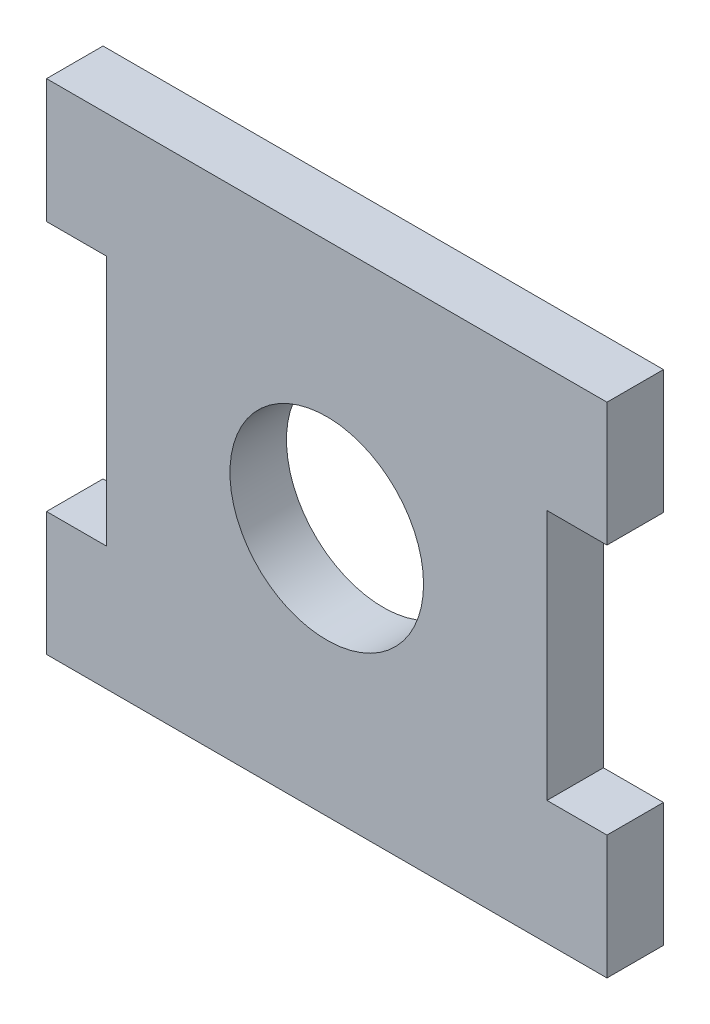
ISO-10303-21;
HEADER;
FILE_DESCRIPTION(('STEP AP214'),'2;1');
FILE_NAME('part.step','',(''),(''),'','','');
FILE_SCHEMA(('AUTOMOTIVE_DESIGN { 1 0 10303 214 1 1 1 1 }'));
ENDSEC;
DATA;
#1=APPLICATION_CONTEXT('core data for automotive mechanical design processes');
#2=APPLICATION_PROTOCOL_DEFINITION('international standard','automotive_design',2000,#1);
#3=PRODUCT_CONTEXT('',#1,'mechanical');
#4=PRODUCT('Part','Part','',(#3));
#5=PRODUCT_RELATED_PRODUCT_CATEGORY('part','',(#4));
#6=PRODUCT_DEFINITION_FORMATION('','',#4);
#7=PRODUCT_DEFINITION_CONTEXT('part definition',#1,'design');
#8=PRODUCT_DEFINITION('design','',#6,#7);
#9=PRODUCT_DEFINITION_SHAPE('','',#8);
#10=(LENGTH_UNIT() NAMED_UNIT(*) SI_UNIT(.MILLI.,.METRE.));
#11=(NAMED_UNIT(*) PLANE_ANGLE_UNIT() SI_UNIT($,.RADIAN.));
#12=(NAMED_UNIT(*) SI_UNIT($,.STERADIAN.) SOLID_ANGLE_UNIT());
#13=UNCERTAINTY_MEASURE_WITH_UNIT(LENGTH_MEASURE(1.E-05),#10,'distance_accuracy_value','');
#14=(GEOMETRIC_REPRESENTATION_CONTEXT(3) GLOBAL_UNCERTAINTY_ASSIGNED_CONTEXT((#13)) GLOBAL_UNIT_ASSIGNED_CONTEXT((#10,
#11,#12)) REPRESENTATION_CONTEXT('',''));
#15=CARTESIAN_POINT('',(0.,0.,0.));
#16=DIRECTION('',(0.,0.,1.));
#17=DIRECTION('',(1.,0.,0.));
#18=AXIS2_PLACEMENT_3D('',#15,#16,#17);
#19=CARTESIAN_POINT('',(0.,0.,5.715));
#20=DIRECTION('',(0.,0.,1.));
#21=DIRECTION('',(1.,0.,0.));
#22=AXIS2_PLACEMENT_3D('',#19,#20,#21);
#23=PLANE('',#22);
#24=DIRECTION('',(0.,-1.,0.));
#25=VECTOR('',#24,1.);
#26=CARTESIAN_POINT('',(0.,12.5222,5.715));
#27=LINE('',#26,#25);
#28=CARTESIAN_POINT('',(0.,12.5222,5.715));
#29=VERTEX_POINT('',#28);
#30=CARTESIAN_POINT('',(0.,0.,5.715));
#31=VERTEX_POINT('',#30);
#32=EDGE_CURVE('E181',#29,#31,#27,.T.);
#33=ORIENTED_EDGE('',*,*,#32,.T.);
#34=DIRECTION('',(1.,0.,0.));
#35=VECTOR('',#34,1.);
#36=CARTESIAN_POINT('',(0.,0.,5.715));
#37=LINE('',#36,#35);
#38=CARTESIAN_POINT('',(56.6928,0.,5.715));
#39=VERTEX_POINT('',#38);
#40=EDGE_CURVE('E109',#31,#39,#37,.T.);
#41=ORIENTED_EDGE('',*,*,#40,.T.);
#42=DIRECTION('',(0.,1.,0.));
#43=VECTOR('',#42,1.);
#44=CARTESIAN_POINT('',(56.6928,0.,5.715));
#45=LINE('',#44,#43);
#46=CARTESIAN_POINT('',(56.6928,12.5222,5.715));
#47=VERTEX_POINT('',#46);
#48=EDGE_CURVE('E208',#39,#47,#45,.T.);
#49=ORIENTED_EDGE('',*,*,#48,.T.);
#50=DIRECTION('',(-1.,0.,0.));
#51=VECTOR('',#50,1.);
#52=CARTESIAN_POINT('',(56.6928,12.5222,5.715));
#53=LINE('',#52,#51);
#54=CARTESIAN_POINT('',(50.6222,12.5222,5.715));
#55=VERTEX_POINT('',#54);
#56=EDGE_CURVE('E227',#47,#55,#53,.T.);
#57=ORIENTED_EDGE('',*,*,#56,.T.);
#58=DIRECTION('',(0.,1.,0.));
#59=VECTOR('',#58,1.);
#60=CARTESIAN_POINT('',(50.6222,12.5222,5.715));
#61=LINE('',#60,#59);
#62=CARTESIAN_POINT('',(50.6222,37.9222,5.715));
#63=VERTEX_POINT('',#62);
#64=EDGE_CURVE('E224',#55,#63,#61,.T.);
#65=ORIENTED_EDGE('',*,*,#64,.T.);
#66=DIRECTION('',(1.,0.,0.));
#67=VECTOR('',#66,1.);
#68=CARTESIAN_POINT('',(50.6222,37.9222,5.715));
#69=LINE('',#68,#67);
#70=CARTESIAN_POINT('',(56.6928,37.9222,5.715));
#71=VERTEX_POINT('',#70);
#72=EDGE_CURVE('E226',#63,#71,#69,.T.);
#73=ORIENTED_EDGE('',*,*,#72,.T.);
#74=DIRECTION('',(0.,1.,0.));
#75=VECTOR('',#74,1.);
#76=CARTESIAN_POINT('',(56.6928,37.9222,5.715));
#77=LINE('',#76,#75);
#78=CARTESIAN_POINT('',(56.6928,50.4444,5.715));
#79=VERTEX_POINT('',#78);
#80=EDGE_CURVE('E229',#71,#79,#77,.T.);
#81=ORIENTED_EDGE('',*,*,#80,.T.);
#82=DIRECTION('',(-1.,0.,0.));
#83=VECTOR('',#82,1.);
#84=CARTESIAN_POINT('',(56.6928,50.4444,5.715));
#85=LINE('',#84,#83);
#86=CARTESIAN_POINT('',(0.,50.4444,5.715));
#87=VERTEX_POINT('',#86);
#88=EDGE_CURVE('E235',#79,#87,#85,.T.);
#89=ORIENTED_EDGE('',*,*,#88,.T.);
#90=DIRECTION('',(0.,-1.,0.));
#91=VECTOR('',#90,1.);
#92=CARTESIAN_POINT('',(0.,50.4444,5.715));
#93=LINE('',#92,#91);
#94=CARTESIAN_POINT('',(0.,37.9222,5.715));
#95=VERTEX_POINT('',#94);
#96=EDGE_CURVE('E140',#87,#95,#93,.T.);
#97=ORIENTED_EDGE('',*,*,#96,.T.);
#98=DIRECTION('',(1.,0.,0.));
#99=VECTOR('',#98,1.);
#100=CARTESIAN_POINT('',(0.,37.9222,5.715));
#101=LINE('',#100,#99);
#102=CARTESIAN_POINT('',(6.0706,37.9222,5.715));
#103=VERTEX_POINT('',#102);
#104=EDGE_CURVE('E134',#95,#103,#101,.T.);
#105=ORIENTED_EDGE('',*,*,#104,.T.);
#106=DIRECTION('',(0.,-1.,0.));
#107=VECTOR('',#106,1.);
#108=CARTESIAN_POINT('',(6.0706,37.9222,5.715));
#109=LINE('',#108,#107);
#110=CARTESIAN_POINT('',(6.0706,12.5222,5.715));
#111=VERTEX_POINT('',#110);
#112=EDGE_CURVE('E138',#103,#111,#109,.T.);
#113=ORIENTED_EDGE('',*,*,#112,.T.);
#114=DIRECTION('',(-1.,0.,0.));
#115=VECTOR('',#114,1.);
#116=CARTESIAN_POINT('',(6.0706,12.5222,5.715));
#117=LINE('',#116,#115);
#118=EDGE_CURVE('E54',#111,#29,#117,.T.);
#119=ORIENTED_EDGE('',*,*,#118,.T.);
#120=EDGE_LOOP('',(#33,#41,#49,#57,#65,#73,#81,#89,#97,#105,#113,#119));
#121=FACE_BOUND('',#120,.T.);
#122=CARTESIAN_POINT('',(28.3464,25.2222,5.715));
#123=DIRECTION('',(0.,0.,1.));
#124=DIRECTION('',(1.,0.,0.));
#125=AXIS2_PLACEMENT_3D('',#122,#123,#124);
#126=CIRCLE('',#125,9.79170000000001);
#127=CARTESIAN_POINT('',(38.1381,25.2222,5.715));
#128=VERTEX_POINT('',#127);
#129=EDGE_CURVE('E162',#128,#128,#126,.T.);
#130=ORIENTED_EDGE('',*,*,#129,.F.);
#131=EDGE_LOOP('',(#130));
#132=FACE_BOUND('',#131,.T.);
#133=ADVANCED_FACE('F37',(#121,#132),#23,.T.);
#134=CARTESIAN_POINT('',(0.,0.,0.));
#135=DIRECTION('',(0.,0.,1.));
#136=DIRECTION('',(1.,0.,0.));
#137=AXIS2_PLACEMENT_3D('',#134,#135,#136);
#138=PLANE('',#137);
#139=DIRECTION('',(0.,-1.,0.));
#140=VECTOR('',#139,1.);
#141=CARTESIAN_POINT('',(0.,12.5222,0.));
#142=LINE('',#141,#140);
#143=CARTESIAN_POINT('',(0.,12.5222,0.));
#144=VERTEX_POINT('',#143);
#145=CARTESIAN_POINT('',(0.,0.,0.));
#146=VERTEX_POINT('',#145);
#147=EDGE_CURVE('E158',#144,#146,#142,.T.);
#148=ORIENTED_EDGE('',*,*,#147,.F.);
#149=DIRECTION('',(-1.,0.,0.));
#150=VECTOR('',#149,1.);
#151=CARTESIAN_POINT('',(6.0706,12.5222,0.));
#152=LINE('',#151,#150);
#153=CARTESIAN_POINT('',(6.0706,12.5222,0.));
#154=VERTEX_POINT('',#153);
#155=EDGE_CURVE('E101',#154,#144,#152,.T.);
#156=ORIENTED_EDGE('',*,*,#155,.F.);
#157=DIRECTION('',(0.,-1.,0.));
#158=VECTOR('',#157,1.);
#159=CARTESIAN_POINT('',(6.0706,37.9222,0.));
#160=LINE('',#159,#158);
#161=CARTESIAN_POINT('',(6.0706,37.9222,0.));
#162=VERTEX_POINT('',#161);
#163=EDGE_CURVE('E95',#162,#154,#160,.T.);
#164=ORIENTED_EDGE('',*,*,#163,.F.);
#165=DIRECTION('',(1.,0.,0.));
#166=VECTOR('',#165,1.);
#167=CARTESIAN_POINT('',(0.,37.9222,0.));
#168=LINE('',#167,#166);
#169=CARTESIAN_POINT('',(0.,37.9222,0.));
#170=VERTEX_POINT('',#169);
#171=EDGE_CURVE('E148',#170,#162,#168,.T.);
#172=ORIENTED_EDGE('',*,*,#171,.F.);
#173=DIRECTION('',(0.,-1.,0.));
#174=VECTOR('',#173,1.);
#175=CARTESIAN_POINT('',(0.,50.4444,0.));
#176=LINE('',#175,#174);
#177=CARTESIAN_POINT('',(0.,50.4444,0.));
#178=VERTEX_POINT('',#177);
#179=EDGE_CURVE('E176',#178,#170,#176,.T.);
#180=ORIENTED_EDGE('',*,*,#179,.F.);
#181=DIRECTION('',(-1.,0.,0.));
#182=VECTOR('',#181,1.);
#183=CARTESIAN_POINT('',(56.6928,50.4444,0.));
#184=LINE('',#183,#182);
#185=CARTESIAN_POINT('',(56.6928,50.4444,0.));
#186=VERTEX_POINT('',#185);
#187=EDGE_CURVE('E174',#186,#178,#184,.T.);
#188=ORIENTED_EDGE('',*,*,#187,.F.);
#189=DIRECTION('',(0.,1.,0.));
#190=VECTOR('',#189,1.);
#191=CARTESIAN_POINT('',(56.6928,37.9222,0.));
#192=LINE('',#191,#190);
#193=CARTESIAN_POINT('',(56.6928,37.9222,0.));
#194=VERTEX_POINT('',#193);
#195=EDGE_CURVE('E172',#194,#186,#192,.T.);
#196=ORIENTED_EDGE('',*,*,#195,.F.);
#197=DIRECTION('',(1.,0.,0.));
#198=VECTOR('',#197,1.);
#199=CARTESIAN_POINT('',(50.6222,37.9222,0.));
#200=LINE('',#199,#198);
#201=CARTESIAN_POINT('',(50.6222,37.9222,0.));
#202=VERTEX_POINT('',#201);
#203=EDGE_CURVE('E170',#202,#194,#200,.T.);
#204=ORIENTED_EDGE('',*,*,#203,.F.);
#205=DIRECTION('',(0.,1.,0.));
#206=VECTOR('',#205,1.);
#207=CARTESIAN_POINT('',(50.6222,12.5222,0.));
#208=LINE('',#207,#206);
#209=CARTESIAN_POINT('',(50.6222,12.5222,0.));
#210=VERTEX_POINT('',#209);
#211=EDGE_CURVE('E168',#210,#202,#208,.T.);
#212=ORIENTED_EDGE('',*,*,#211,.F.);
#213=DIRECTION('',(-1.,0.,0.));
#214=VECTOR('',#213,1.);
#215=CARTESIAN_POINT('',(56.6928,12.5222,0.));
#216=LINE('',#215,#214);
#217=CARTESIAN_POINT('',(56.6928,12.5222,0.));
#218=VERTEX_POINT('',#217);
#219=EDGE_CURVE('E166',#218,#210,#216,.T.);
#220=ORIENTED_EDGE('',*,*,#219,.F.);
#221=DIRECTION('',(0.,1.,0.));
#222=VECTOR('',#221,1.);
#223=CARTESIAN_POINT('',(56.6928,0.,0.));
#224=LINE('',#223,#222);
#225=CARTESIAN_POINT('',(56.6928,0.,0.));
#226=VERTEX_POINT('',#225);
#227=EDGE_CURVE('E164',#226,#218,#224,.T.);
#228=ORIENTED_EDGE('',*,*,#227,.F.);
#229=DIRECTION('',(1.,0.,0.));
#230=VECTOR('',#229,1.);
#231=CARTESIAN_POINT('',(0.,0.,0.));
#232=LINE('',#231,#230);
#233=EDGE_CURVE('E161',#146,#226,#232,.T.);
#234=ORIENTED_EDGE('',*,*,#233,.F.);
#235=EDGE_LOOP('',(#148,#156,#164,#172,#180,#188,#196,#204,#212,#220,#228,#234));
#236=FACE_BOUND('',#235,.T.);
#237=CARTESIAN_POINT('',(28.3464,25.2222,0.));
#238=DIRECTION('',(0.,0.,1.));
#239=DIRECTION('',(1.,0.,0.));
#240=AXIS2_PLACEMENT_3D('',#237,#238,#239);
#241=CIRCLE('',#240,9.79170000000001);
#242=CARTESIAN_POINT('',(38.1381,25.2222,0.));
#243=VERTEX_POINT('',#242);
#244=EDGE_CURVE('E382',#243,#243,#241,.T.);
#245=ORIENTED_EDGE('',*,*,#244,.T.);
#246=EDGE_LOOP('',(#245));
#247=FACE_BOUND('',#246,.T.);
#248=ADVANCED_FACE('F212',(#236,#247),#138,.F.);
#249=CARTESIAN_POINT('',(0.,12.5222,5.715));
#250=DIRECTION('',(1.,0.,0.));
#251=DIRECTION('',(0.,0.,-1.));
#252=AXIS2_PLACEMENT_3D('',#249,#250,#251);
#253=PLANE('',#252);
#254=ORIENTED_EDGE('',*,*,#147,.T.);
#255=DIRECTION('',(0.,0.,-1.));
#256=VECTOR('',#255,1.);
#257=CARTESIAN_POINT('',(0.,0.,5.715));
#258=LINE('',#257,#256);
#259=EDGE_CURVE('E11',#31,#146,#258,.T.);
#260=ORIENTED_EDGE('',*,*,#259,.F.);
#261=ORIENTED_EDGE('',*,*,#32,.F.);
#262=DIRECTION('',(0.,0.,-1.));
#263=VECTOR('',#262,1.);
#264=CARTESIAN_POINT('',(0.,12.5222,5.715));
#265=LINE('',#264,#263);
#266=EDGE_CURVE('E154',#29,#144,#265,.T.);
#267=ORIENTED_EDGE('',*,*,#266,.T.);
#268=EDGE_LOOP('',(#254,#260,#261,#267));
#269=FACE_BOUND('',#268,.T.);
#270=ADVANCED_FACE('F39',(#269),#253,.F.);
#271=CARTESIAN_POINT('',(0.,0.,5.715));
#272=DIRECTION('',(0.,1.,0.));
#273=DIRECTION('',(-1.,0.,0.));
#274=AXIS2_PLACEMENT_3D('',#271,#272,#273);
#275=PLANE('',#274);
#276=ORIENTED_EDGE('',*,*,#233,.T.);
#277=DIRECTION('',(0.,0.,-1.));
#278=VECTOR('',#277,1.);
#279=CARTESIAN_POINT('',(56.6928,0.,5.715));
#280=LINE('',#279,#278);
#281=EDGE_CURVE('E46',#39,#226,#280,.T.);
#282=ORIENTED_EDGE('',*,*,#281,.F.);
#283=ORIENTED_EDGE('',*,*,#40,.F.);
#284=ORIENTED_EDGE('',*,*,#259,.T.);
#285=EDGE_LOOP('',(#276,#282,#283,#284));
#286=FACE_BOUND('',#285,.T.);
#287=ADVANCED_FACE('F269',(#286),#275,.F.);
#288=CARTESIAN_POINT('',(56.6928,0.,5.715));
#289=DIRECTION('',(-1.,0.,0.));
#290=DIRECTION('',(0.,0.,1.));
#291=AXIS2_PLACEMENT_3D('',#288,#289,#290);
#292=PLANE('',#291);
#293=ORIENTED_EDGE('',*,*,#227,.T.);
#294=DIRECTION('',(0.,0.,-1.));
#295=VECTOR('',#294,1.);
#296=CARTESIAN_POINT('',(56.6928,12.5222,5.715));
#297=LINE('',#296,#295);
#298=EDGE_CURVE('E200',#47,#218,#297,.T.);
#299=ORIENTED_EDGE('',*,*,#298,.F.);
#300=ORIENTED_EDGE('',*,*,#48,.F.);
#301=ORIENTED_EDGE('',*,*,#281,.T.);
#302=EDGE_LOOP('',(#293,#299,#300,#301));
#303=FACE_BOUND('',#302,.T.);
#304=ADVANCED_FACE('F206',(#303),#292,.F.);
#305=CARTESIAN_POINT('',(56.6928,12.5222,5.715));
#306=DIRECTION('',(0.,-1.,0.));
#307=DIRECTION('',(1.,0.,0.));
#308=AXIS2_PLACEMENT_3D('',#305,#306,#307);
#309=PLANE('',#308);
#310=ORIENTED_EDGE('',*,*,#219,.T.);
#311=DIRECTION('',(0.,0.,-1.));
#312=VECTOR('',#311,1.);
#313=CARTESIAN_POINT('',(50.6222,12.5222,5.715));
#314=LINE('',#313,#312);
#315=EDGE_CURVE('E197',#55,#210,#314,.T.);
#316=ORIENTED_EDGE('',*,*,#315,.F.);
#317=ORIENTED_EDGE('',*,*,#56,.F.);
#318=ORIENTED_EDGE('',*,*,#298,.T.);
#319=EDGE_LOOP('',(#310,#316,#317,#318));
#320=FACE_BOUND('',#319,.T.);
#321=ADVANCED_FACE('F218',(#320),#309,.F.);
#322=CARTESIAN_POINT('',(50.6222,12.5222,5.715));
#323=DIRECTION('',(-1.,0.,0.));
#324=DIRECTION('',(0.,0.,1.));
#325=AXIS2_PLACEMENT_3D('',#322,#323,#324);
#326=PLANE('',#325);
#327=ORIENTED_EDGE('',*,*,#211,.T.);
#328=DIRECTION('',(0.,0.,-1.));
#329=VECTOR('',#328,1.);
#330=CARTESIAN_POINT('',(50.6222,37.9222,5.715));
#331=LINE('',#330,#329);
#332=EDGE_CURVE('E194',#63,#202,#331,.T.);
#333=ORIENTED_EDGE('',*,*,#332,.F.);
#334=ORIENTED_EDGE('',*,*,#64,.F.);
#335=ORIENTED_EDGE('',*,*,#315,.T.);
#336=EDGE_LOOP('',(#327,#333,#334,#335));
#337=FACE_BOUND('',#336,.T.);
#338=ADVANCED_FACE('F222',(#337),#326,.F.);
#339=CARTESIAN_POINT('',(50.6222,37.9222,5.715));
#340=DIRECTION('',(0.,1.,0.));
#341=DIRECTION('',(0.,0.,1.));
#342=AXIS2_PLACEMENT_3D('',#339,#340,#341);
#343=PLANE('',#342);
#344=ORIENTED_EDGE('',*,*,#203,.T.);
#345=DIRECTION('',(0.,0.,-1.));
#346=VECTOR('',#345,1.);
#347=CARTESIAN_POINT('',(56.6928,37.9222,5.715));
#348=LINE('',#347,#346);
#349=EDGE_CURVE('E191',#71,#194,#348,.T.);
#350=ORIENTED_EDGE('',*,*,#349,.F.);
#351=ORIENTED_EDGE('',*,*,#72,.F.);
#352=ORIENTED_EDGE('',*,*,#332,.T.);
#353=EDGE_LOOP('',(#344,#350,#351,#352));
#354=FACE_BOUND('',#353,.T.);
#355=ADVANCED_FACE('F282',(#354),#343,.F.);
#356=CARTESIAN_POINT('',(56.6928,37.9222,5.715));
#357=DIRECTION('',(-1.,0.,0.));
#358=DIRECTION('',(0.,0.,1.));
#359=AXIS2_PLACEMENT_3D('',#356,#357,#358);
#360=PLANE('',#359);
#361=ORIENTED_EDGE('',*,*,#195,.T.);
#362=DIRECTION('',(0.,0.,-1.));
#363=VECTOR('',#362,1.);
#364=CARTESIAN_POINT('',(56.6928,50.4444,5.715));
#365=LINE('',#364,#363);
#366=EDGE_CURVE('E188',#79,#186,#365,.T.);
#367=ORIENTED_EDGE('',*,*,#366,.F.);
#368=ORIENTED_EDGE('',*,*,#80,.F.);
#369=ORIENTED_EDGE('',*,*,#349,.T.);
#370=EDGE_LOOP('',(#361,#367,#368,#369));
#371=FACE_BOUND('',#370,.T.);
#372=ADVANCED_FACE('F285',(#371),#360,.F.);
#373=CARTESIAN_POINT('',(56.6928,50.4444,5.715));
#374=DIRECTION('',(0.,-1.,0.));
#375=DIRECTION('',(1.,0.,0.));
#376=AXIS2_PLACEMENT_3D('',#373,#374,#375);
#377=PLANE('',#376);
#378=ORIENTED_EDGE('',*,*,#187,.T.);
#379=DIRECTION('',(0.,0.,-1.));
#380=VECTOR('',#379,1.);
#381=CARTESIAN_POINT('',(0.,50.4444,5.715));
#382=LINE('',#381,#380);
#383=EDGE_CURVE('E185',#87,#178,#382,.T.);
#384=ORIENTED_EDGE('',*,*,#383,.F.);
#385=ORIENTED_EDGE('',*,*,#88,.F.);
#386=ORIENTED_EDGE('',*,*,#366,.T.);
#387=EDGE_LOOP('',(#378,#384,#385,#386));
#388=FACE_BOUND('',#387,.T.);
#389=ADVANCED_FACE('F241',(#388),#377,.F.);
#390=CARTESIAN_POINT('',(0.,50.4444,5.715));
#391=DIRECTION('',(1.,0.,0.));
#392=DIRECTION('',(0.,1.,0.));
#393=AXIS2_PLACEMENT_3D('',#390,#391,#392);
#394=PLANE('',#393);
#395=ORIENTED_EDGE('',*,*,#179,.T.);
#396=DIRECTION('',(0.,0.,-1.));
#397=VECTOR('',#396,1.);
#398=CARTESIAN_POINT('',(0.,37.9222,5.715));
#399=LINE('',#398,#397);
#400=EDGE_CURVE('E149',#95,#170,#399,.T.);
#401=ORIENTED_EDGE('',*,*,#400,.F.);
#402=ORIENTED_EDGE('',*,*,#96,.F.);
#403=ORIENTED_EDGE('',*,*,#383,.T.);
#404=EDGE_LOOP('',(#395,#401,#402,#403));
#405=FACE_BOUND('',#404,.T.);
#406=ADVANCED_FACE('F245',(#405),#394,.F.);
#407=CARTESIAN_POINT('',(0.,37.9222,5.715));
#408=DIRECTION('',(0.,1.,0.));
#409=DIRECTION('',(0.,0.,1.));
#410=AXIS2_PLACEMENT_3D('',#407,#408,#409);
#411=PLANE('',#410);
#412=ORIENTED_EDGE('',*,*,#171,.T.);
#413=DIRECTION('',(0.,0.,-1.));
#414=VECTOR('',#413,1.);
#415=CARTESIAN_POINT('',(6.0706,37.9222,5.715));
#416=LINE('',#415,#414);
#417=EDGE_CURVE('E145',#103,#162,#416,.T.);
#418=ORIENTED_EDGE('',*,*,#417,.F.);
#419=ORIENTED_EDGE('',*,*,#104,.F.);
#420=ORIENTED_EDGE('',*,*,#400,.T.);
#421=EDGE_LOOP('',(#412,#418,#419,#420));
#422=FACE_BOUND('',#421,.T.);
#423=ADVANCED_FACE('F146',(#422),#411,.F.);
#424=CARTESIAN_POINT('',(6.0706,37.9222,5.715));
#425=DIRECTION('',(1.,0.,0.));
#426=DIRECTION('',(0.,0.,-1.));
#427=AXIS2_PLACEMENT_3D('',#424,#425,#426);
#428=PLANE('',#427);
#429=ORIENTED_EDGE('',*,*,#163,.T.);
#430=DIRECTION('',(0.,0.,-1.));
#431=VECTOR('',#430,1.);
#432=CARTESIAN_POINT('',(6.0706,12.5222,5.715));
#433=LINE('',#432,#431);
#434=EDGE_CURVE('E150',#111,#154,#433,.T.);
#435=ORIENTED_EDGE('',*,*,#434,.F.);
#436=ORIENTED_EDGE('',*,*,#112,.F.);
#437=ORIENTED_EDGE('',*,*,#417,.T.);
#438=EDGE_LOOP('',(#429,#435,#436,#437));
#439=FACE_BOUND('',#438,.T.);
#440=ADVANCED_FACE('F152',(#439),#428,.F.);
#441=CARTESIAN_POINT('',(6.0706,12.5222,5.715));
#442=DIRECTION('',(0.,-1.,0.));
#443=DIRECTION('',(0.,0.,-1.));
#444=AXIS2_PLACEMENT_3D('',#441,#442,#443);
#445=PLANE('',#444);
#446=ORIENTED_EDGE('',*,*,#155,.T.);
#447=ORIENTED_EDGE('',*,*,#266,.F.);
#448=ORIENTED_EDGE('',*,*,#118,.F.);
#449=ORIENTED_EDGE('',*,*,#434,.T.);
#450=EDGE_LOOP('',(#446,#447,#448,#449));
#451=FACE_BOUND('',#450,.T.);
#452=ADVANCED_FACE('F249',(#451),#445,.F.);
#453=CARTESIAN_POINT('',(28.3464,25.2222,5.715));
#454=DIRECTION('',(0.,0.,-1.));
#455=DIRECTION('',(-1.,0.,0.));
#456=AXIS2_PLACEMENT_3D('',#453,#454,#455);
#457=CYLINDRICAL_SURFACE('',#456,9.79170000000001);
#458=ORIENTED_EDGE('',*,*,#129,.T.);
#459=EDGE_LOOP('',(#458));
#460=FACE_BOUND('',#459,.T.);
#461=ORIENTED_EDGE('',*,*,#244,.F.);
#462=EDGE_LOOP('',(#461));
#463=FACE_BOUND('',#462,.T.);
#464=ADVANCED_FACE('F251',(#460,#463),#457,.F.);
#465=CLOSED_SHELL('',(#133,#248,#270,#287,#304,#321,#338,#355,#372,#389,#406,#423,#440,#452,#464));
#466=MANIFOLD_SOLID_BREP('B2',#465);
#467=ADVANCED_BREP_SHAPE_REPRESENTATION('',(#18,#466),#14);
#468=SHAPE_DEFINITION_REPRESENTATION(#9,#467);
ENDSEC;
END-ISO-10303-21;
